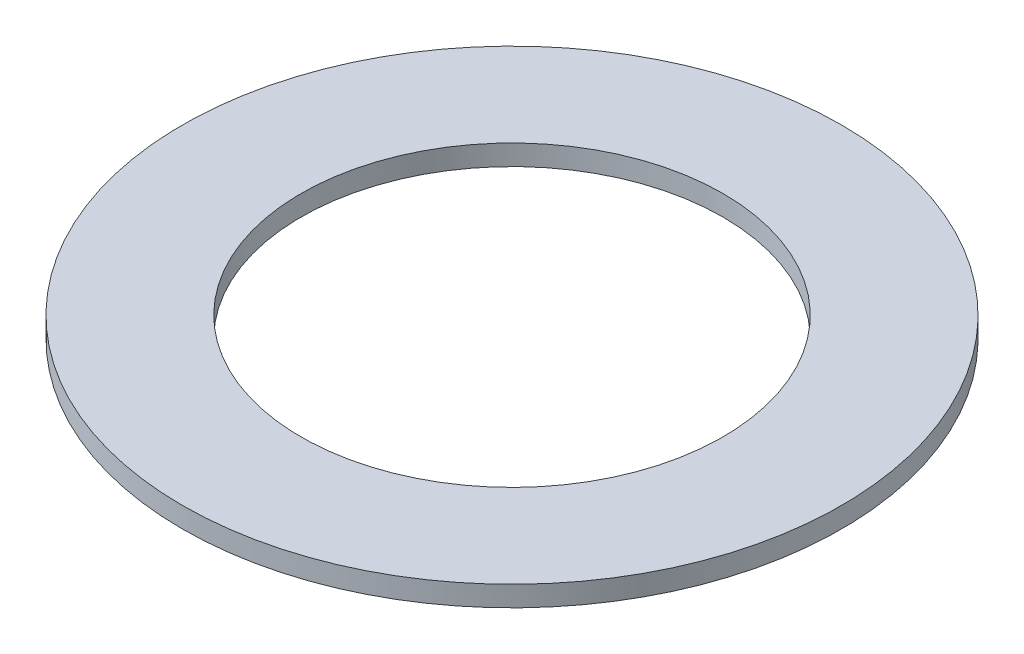
ISO-10303-21;
HEADER;
FILE_DESCRIPTION(('STEP AP214'),'2;1');
FILE_NAME('part.step','',(''),(''),'','','');
FILE_SCHEMA(('AUTOMOTIVE_DESIGN { 1 0 10303 214 1 1 1 1 }'));
ENDSEC;
DATA;
#1=APPLICATION_CONTEXT('core data for automotive mechanical design processes');
#2=APPLICATION_PROTOCOL_DEFINITION('international standard','automotive_design',2000,#1);
#3=PRODUCT_CONTEXT('',#1,'mechanical');
#4=PRODUCT('Part','Part','',(#3));
#5=PRODUCT_RELATED_PRODUCT_CATEGORY('part','',(#4));
#6=PRODUCT_DEFINITION_FORMATION('','',#4);
#7=PRODUCT_DEFINITION_CONTEXT('part definition',#1,'design');
#8=PRODUCT_DEFINITION('design','',#6,#7);
#9=PRODUCT_DEFINITION_SHAPE('','',#8);
#10=(LENGTH_UNIT() NAMED_UNIT(*) SI_UNIT(.MILLI.,.METRE.));
#11=(NAMED_UNIT(*) PLANE_ANGLE_UNIT() SI_UNIT($,.RADIAN.));
#12=(NAMED_UNIT(*) SI_UNIT($,.STERADIAN.) SOLID_ANGLE_UNIT());
#13=UNCERTAINTY_MEASURE_WITH_UNIT(LENGTH_MEASURE(1.E-05),#10,'distance_accuracy_value','');
#14=(GEOMETRIC_REPRESENTATION_CONTEXT(3) GLOBAL_UNCERTAINTY_ASSIGNED_CONTEXT((#13)) GLOBAL_UNIT_ASSIGNED_CONTEXT((#10,
#11,#12)) REPRESENTATION_CONTEXT('',''));
#15=CARTESIAN_POINT('',(0.,0.,0.));
#16=DIRECTION('',(0.,0.,1.));
#17=DIRECTION('',(1.,0.,0.));
#18=AXIS2_PLACEMENT_3D('',#15,#16,#17);
#19=CARTESIAN_POINT('',(0.,0.,0.));
#20=DIRECTION('',(0.,1.,0.));
#21=DIRECTION('',(0.,0.,1.));
#22=AXIS2_PLACEMENT_3D('',#19,#20,#21);
#23=PLANE('',#22);
#24=CARTESIAN_POINT('',(0.,0.,0.));
#25=DIRECTION('',(0.,-1.,0.));
#26=DIRECTION('',(0.,0.,-1.));
#27=AXIS2_PLACEMENT_3D('',#24,#25,#26);
#28=CIRCLE('',#27,16.256);
#29=CARTESIAN_POINT('',(0.,0.,-16.256));
#30=VERTEX_POINT('',#29);
#31=EDGE_CURVE('E26',#30,#30,#28,.F.);
#32=ORIENTED_EDGE('',*,*,#31,.T.);
#33=EDGE_LOOP('',(#32));
#34=FACE_BOUND('',#33,.T.);
#35=CARTESIAN_POINT('',(0.,0.,0.));
#36=DIRECTION('',(0.,-1.,0.));
#37=DIRECTION('',(0.,0.,-1.));
#38=AXIS2_PLACEMENT_3D('',#35,#36,#37);
#39=CIRCLE('',#38,25.4);
#40=CARTESIAN_POINT('',(0.,0.,-25.4));
#41=VERTEX_POINT('',#40);
#42=EDGE_CURVE('E17',#41,#41,#39,.F.);
#43=ORIENTED_EDGE('',*,*,#42,.F.);
#44=EDGE_LOOP('',(#43));
#45=FACE_BOUND('',#44,.T.);
#46=ADVANCED_FACE('F14',(#34,#45),#23,.F.);
#47=CARTESIAN_POINT('',(0.,1.5748,0.));
#48=DIRECTION('',(0.,-1.,0.));
#49=DIRECTION('',(0.,0.,-1.));
#50=AXIS2_PLACEMENT_3D('',#47,#48,#49);
#51=CYLINDRICAL_SURFACE('',#50,25.4);
#52=ORIENTED_EDGE('',*,*,#42,.T.);
#53=EDGE_LOOP('',(#52));
#54=FACE_BOUND('',#53,.T.);
#55=CARTESIAN_POINT('',(0.,1.5748,0.));
#56=DIRECTION('',(0.,-1.,0.));
#57=DIRECTION('',(0.,0.,-1.));
#58=AXIS2_PLACEMENT_3D('',#55,#56,#57);
#59=CIRCLE('',#58,25.4);
#60=CARTESIAN_POINT('',(0.,1.5748,-25.4));
#61=VERTEX_POINT('',#60);
#62=EDGE_CURVE('E21',#61,#61,#59,.F.);
#63=ORIENTED_EDGE('',*,*,#62,.F.);
#64=EDGE_LOOP('',(#63));
#65=FACE_BOUND('',#64,.T.);
#66=ADVANCED_FACE('F34',(#54,#65),#51,.T.);
#67=CARTESIAN_POINT('',(0.,1.5748,0.));
#68=DIRECTION('',(0.,-1.,0.));
#69=DIRECTION('',(0.,0.,-1.));
#70=AXIS2_PLACEMENT_3D('',#67,#68,#69);
#71=CYLINDRICAL_SURFACE('',#70,16.256);
#72=CARTESIAN_POINT('',(0.,1.5748,0.));
#73=DIRECTION('',(0.,-1.,0.));
#74=DIRECTION('',(0.,0.,-1.));
#75=AXIS2_PLACEMENT_3D('',#72,#73,#74);
#76=CIRCLE('',#75,16.256);
#77=CARTESIAN_POINT('',(0.,1.5748,-16.256));
#78=VERTEX_POINT('',#77);
#79=EDGE_CURVE('E10',#78,#78,#76,.T.);
#80=ORIENTED_EDGE('',*,*,#79,.F.);
#81=EDGE_LOOP('',(#80));
#82=FACE_BOUND('',#81,.T.);
#83=ORIENTED_EDGE('',*,*,#31,.F.);
#84=EDGE_LOOP('',(#83));
#85=FACE_BOUND('',#84,.T.);
#86=ADVANCED_FACE('F42',(#82,#85),#71,.F.);
#87=CARTESIAN_POINT('',(0.,1.5748,0.));
#88=DIRECTION('',(0.,1.,0.));
#89=DIRECTION('',(0.,0.,1.));
#90=AXIS2_PLACEMENT_3D('',#87,#88,#89);
#91=PLANE('',#90);
#92=ORIENTED_EDGE('',*,*,#79,.T.);
#93=EDGE_LOOP('',(#92));
#94=FACE_BOUND('',#93,.T.);
#95=ORIENTED_EDGE('',*,*,#62,.T.);
#96=EDGE_LOOP('',(#95));
#97=FACE_BOUND('',#96,.T.);
#98=ADVANCED_FACE('F43',(#94,#97),#91,.T.);
#99=CLOSED_SHELL('',(#46,#66,#86,#98));
#100=MANIFOLD_SOLID_BREP('B1',#99);
#101=ADVANCED_BREP_SHAPE_REPRESENTATION('',(#18,#100),#14);
#102=SHAPE_DEFINITION_REPRESENTATION(#9,#101);
ENDSEC;
END-ISO-10303-21;
